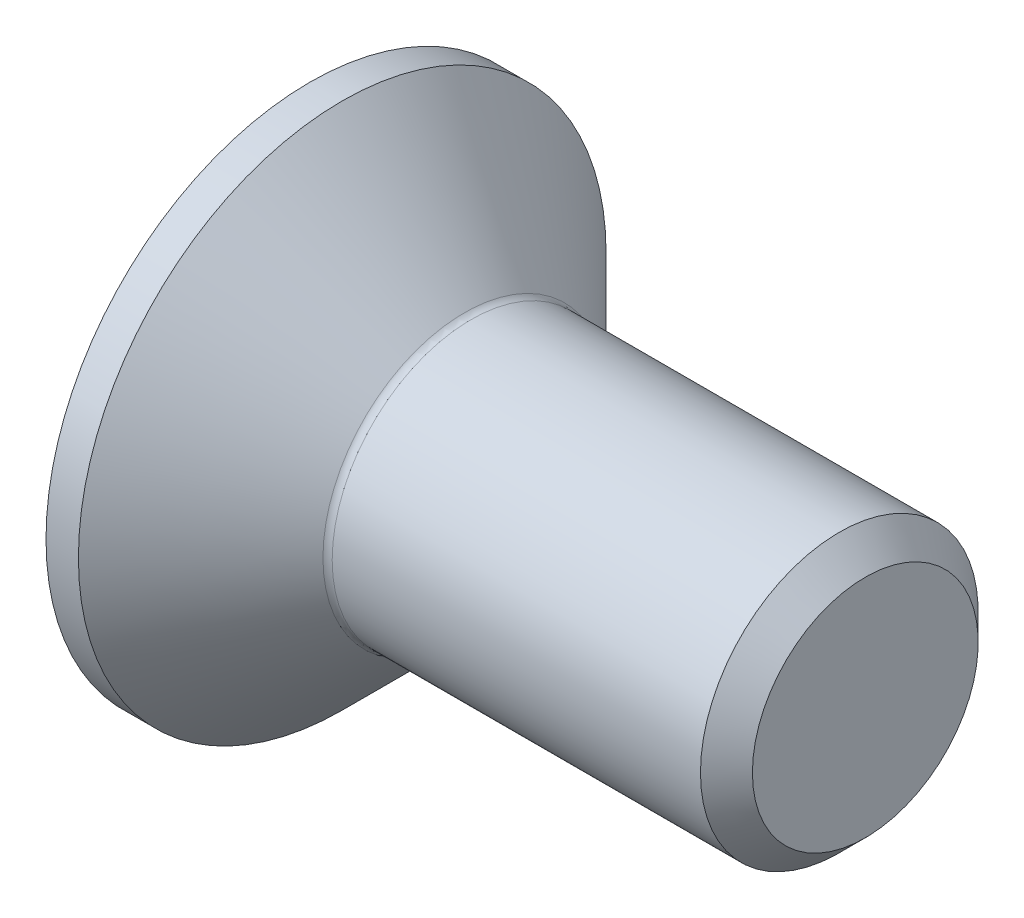
ISO-10303-21;
HEADER;
FILE_DESCRIPTION(('STEP AP214'),'2;1');
FILE_NAME('part.step','',(''),(''),'','','');
FILE_SCHEMA(('AUTOMOTIVE_DESIGN { 1 0 10303 214 1 1 1 1 }'));
ENDSEC;
DATA;
#1=APPLICATION_CONTEXT('core data for automotive mechanical design processes');
#2=APPLICATION_PROTOCOL_DEFINITION('international standard','automotive_design',2000,#1);
#3=PRODUCT_CONTEXT('',#1,'mechanical');
#4=PRODUCT('Part','Part','',(#3));
#5=PRODUCT_RELATED_PRODUCT_CATEGORY('part','',(#4));
#6=PRODUCT_DEFINITION_FORMATION('','',#4);
#7=PRODUCT_DEFINITION_CONTEXT('part definition',#1,'design');
#8=PRODUCT_DEFINITION('design','',#6,#7);
#9=PRODUCT_DEFINITION_SHAPE('','',#8);
#10=(LENGTH_UNIT() NAMED_UNIT(*) SI_UNIT(.MILLI.,.METRE.));
#11=(NAMED_UNIT(*) PLANE_ANGLE_UNIT() SI_UNIT($,.RADIAN.));
#12=(NAMED_UNIT(*) SI_UNIT($,.STERADIAN.) SOLID_ANGLE_UNIT());
#13=UNCERTAINTY_MEASURE_WITH_UNIT(LENGTH_MEASURE(1.E-05),#10,'distance_accuracy_value','');
#14=(GEOMETRIC_REPRESENTATION_CONTEXT(3) GLOBAL_UNCERTAINTY_ASSIGNED_CONTEXT((#13)) GLOBAL_UNIT_ASSIGNED_CONTEXT((#10,
#11,#12)) REPRESENTATION_CONTEXT('',''));
#15=CARTESIAN_POINT('',(0.,0.,0.));
#16=DIRECTION('',(0.,0.,1.));
#17=DIRECTION('',(1.,0.,0.));
#18=AXIS2_PLACEMENT_3D('',#15,#16,#17);
#19=CARTESIAN_POINT('',(6.,1.2195,0.));
#20=DIRECTION('',(1.,0.,0.));
#21=DIRECTION('',(0.,0.,-1.));
#22=AXIS2_PLACEMENT_3D('',#19,#20,#21);
#23=PLANE('',#22);
#24=CARTESIAN_POINT('',(5.99999999997181,0.,0.));
#25=DIRECTION('',(-1.,0.,0.));
#26=DIRECTION('',(0.,0.,1.));
#27=AXIS2_PLACEMENT_3D('',#24,#25,#26);
#28=CIRCLE('',#27,1.21950000004745);
#29=CARTESIAN_POINT('',(5.99999999997181,0.,1.21950000004745));
#30=VERTEX_POINT('',#29);
#31=EDGE_CURVE('E19',#30,#30,#28,.T.);
#32=ORIENTED_EDGE('',*,*,#31,.F.);
#33=EDGE_LOOP('',(#32));
#34=FACE_BOUND('',#33,.T.);
#35=ADVANCED_FACE('F16',(#34),#23,.T.);
#36=CARTESIAN_POINT('',(5.71950000011157,0.,0.));
#37=DIRECTION('',(-1.,0.,0.));
#38=DIRECTION('',(0.,0.,1.));
#39=AXIS2_PLACEMENT_3D('',#36,#37,#38);
#40=CONICAL_SURFACE('',#39,1.49999999985084,0.785398163296123);
#41=ORIENTED_EDGE('',*,*,#31,.T.);
#42=EDGE_LOOP('',(#41));
#43=FACE_BOUND('',#42,.T.);
#44=CARTESIAN_POINT('',(5.71949999999997,0.,0.));
#45=DIRECTION('',(-1.,0.,0.));
#46=DIRECTION('',(0.,0.,1.));
#47=AXIS2_PLACEMENT_3D('',#44,#45,#46);
#48=CIRCLE('',#47,1.49999999999998);
#49=CARTESIAN_POINT('',(5.71949999999997,0.,1.49999999999998));
#50=VERTEX_POINT('',#49);
#51=EDGE_CURVE('E308',#50,#50,#48,.T.);
#52=ORIENTED_EDGE('',*,*,#51,.F.);
#53=EDGE_LOOP('',(#52));
#54=FACE_BOUND('',#53,.T.);
#55=ADVANCED_FACE('F231',(#43,#54),#40,.T.);
#56=CARTESIAN_POINT('',(0.,0.,0.));
#57=DIRECTION('',(-1.,0.,0.));
#58=DIRECTION('',(0.,0.,1.));
#59=AXIS2_PLACEMENT_3D('',#56,#57,#58);
#60=CYLINDRICAL_SURFACE('',#59,1.49999999999998);
#61=ORIENTED_EDGE('',*,*,#51,.T.);
#62=EDGE_LOOP('',(#61));
#63=FACE_BOUND('',#62,.T.);
#64=CARTESIAN_POINT('',(1.74142135623733,0.,0.));
#65=DIRECTION('',(-1.,0.,0.));
#66=DIRECTION('',(0.,0.,1.));
#67=AXIS2_PLACEMENT_3D('',#64,#65,#66);
#68=CIRCLE('',#67,1.49999999999998);
#69=CARTESIAN_POINT('',(1.74142135623733,0.,1.49999999999998));
#70=VERTEX_POINT('',#69);
#71=EDGE_CURVE('E218',#70,#70,#68,.F.);
#72=ORIENTED_EDGE('',*,*,#71,.T.);
#73=EDGE_LOOP('',(#72));
#74=FACE_BOUND('',#73,.T.);
#75=ADVANCED_FACE('F227',(#63,#74),#60,.T.);
#76=CARTESIAN_POINT('',(1.74142135623733,0.,0.));
#77=DIRECTION('',(-1.,0.,0.));
#78=DIRECTION('',(0.,0.,1.));
#79=AXIS2_PLACEMENT_3D('',#76,#77,#78);
#80=TOROIDAL_SURFACE('',#79,1.59999999999998,0.1);
#81=ORIENTED_EDGE('',*,*,#71,.F.);
#82=EDGE_LOOP('',(#81));
#83=FACE_BOUND('',#82,.T.);
#84=CARTESIAN_POINT('',(1.67071067812685,0.,0.));
#85=DIRECTION('',(-1.,0.,0.));
#86=DIRECTION('',(0.,0.,1.));
#87=AXIS2_PLACEMENT_3D('',#84,#85,#86);
#88=CIRCLE('',#87,1.52928932192253);
#89=CARTESIAN_POINT('',(1.67071067812685,0.,1.52928932192253));
#90=VERTEX_POINT('',#89);
#91=EDGE_CURVE('E97',#90,#90,#88,.T.);
#92=ORIENTED_EDGE('',*,*,#91,.F.);
#93=EDGE_LOOP('',(#92));
#94=FACE_BOUND('',#93,.T.);
#95=ADVANCED_FACE('F223',(#83,#94),#80,.F.);
#96=CARTESIAN_POINT('',(1.20000000015352,0.,0.));
#97=DIRECTION('',(-1.,0.,0.));
#98=DIRECTION('',(0.,0.,1.));
#99=AXIS2_PLACEMENT_3D('',#96,#97,#98);
#100=CONICAL_SURFACE('',#99,1.00999999978058,1.04719755090824);
#101=CARTESIAN_POINT('',(1.78312377201451,0.,-3.41060513164848E-10));
#102=VERTEX_POINT('',#101);
#103=VERTEX_LOOP('',#102);
#104=FACE_BOUND('',#103,.T.);
#105=CARTESIAN_POINT('',(1.20000000005507,0.,0.));
#106=DIRECTION('',(-1.,0.,0.));
#107=DIRECTION('',(0.,0.,1.));
#108=AXIS2_PLACEMENT_3D('',#105,#106,#107);
#109=CIRCLE('',#108,1.00999999995111);
#110=CARTESIAN_POINT('',(1.20000000002328,0.,-1.00999999999175));
#111=VERTEX_POINT('',#110);
#112=CARTESIAN_POINT('',(1.20000000002753,0.874685657801112,-0.504999999987776));
#113=VERTEX_POINT('',#112);
#114=EDGE_CURVE('E314',#111,#113,#109,.F.);
#115=ORIENTED_EDGE('',*,*,#114,.F.);
#116=CARTESIAN_POINT('',(1.20000000005507,0.,0.));
#117=DIRECTION('',(-1.,0.,0.));
#118=DIRECTION('',(0.,0.,1.));
#119=AXIS2_PLACEMENT_3D('',#116,#117,#118);
#120=CIRCLE('',#119,1.00999999995111);
#121=CARTESIAN_POINT('',(1.20000000002753,-0.874685657801111,-0.504999999987777));
#122=VERTEX_POINT('',#121);
#123=EDGE_CURVE('E92',#122,#111,#120,.F.);
#124=ORIENTED_EDGE('',*,*,#123,.F.);
#125=CARTESIAN_POINT('',(1.20000000005507,0.,0.));
#126=DIRECTION('',(-1.,0.,0.));
#127=DIRECTION('',(0.,0.,1.));
#128=AXIS2_PLACEMENT_3D('',#125,#126,#127);
#129=CIRCLE('',#128,1.00999999995111);
#130=CARTESIAN_POINT('',(1.20000000002753,-0.874685657801111,0.504999999987777));
#131=VERTEX_POINT('',#130);
#132=EDGE_CURVE('E86',#131,#122,#129,.F.);
#133=ORIENTED_EDGE('',*,*,#132,.F.);
#134=CARTESIAN_POINT('',(1.20000000005507,0.,0.));
#135=DIRECTION('',(-1.,0.,0.));
#136=DIRECTION('',(0.,0.,1.));
#137=AXIS2_PLACEMENT_3D('',#134,#135,#136);
#138=CIRCLE('',#137,1.00999999995111);
#139=CARTESIAN_POINT('',(1.20000000002328,0.,1.00999999999175));
#140=VERTEX_POINT('',#139);
#141=EDGE_CURVE('E89',#140,#131,#138,.F.);
#142=ORIENTED_EDGE('',*,*,#141,.F.);
#143=CARTESIAN_POINT('',(1.20000000005507,0.,0.));
#144=DIRECTION('',(-1.,0.,0.));
#145=DIRECTION('',(0.,0.,1.));
#146=AXIS2_PLACEMENT_3D('',#143,#144,#145);
#147=CIRCLE('',#146,1.00999999995111);
#148=CARTESIAN_POINT('',(1.20000000002753,0.874685657801111,0.504999999987777));
#149=VERTEX_POINT('',#148);
#150=EDGE_CURVE('E108',#149,#140,#147,.F.);
#151=ORIENTED_EDGE('',*,*,#150,.F.);
#152=CARTESIAN_POINT('',(1.20000000005507,0.,0.));
#153=DIRECTION('',(-1.,0.,0.));
#154=DIRECTION('',(0.,0.,1.));
#155=AXIS2_PLACEMENT_3D('',#152,#153,#154);
#156=CIRCLE('',#155,1.00999999995111);
#157=EDGE_CURVE('E311',#113,#149,#156,.F.);
#158=ORIENTED_EDGE('',*,*,#157,.F.);
#159=EDGE_LOOP('',(#115,#124,#133,#142,#151,#158));
#160=FACE_BOUND('',#159,.T.);
#161=ADVANCED_FACE('F88',(#104,#160),#100,.F.);
#162=CARTESIAN_POINT('',(0.350000000082673,0.,0.));
#163=DIRECTION('',(-1.,0.,0.));
#164=DIRECTION('',(0.,0.,1.));
#165=AXIS2_PLACEMENT_3D('',#162,#163,#164);
#166=CONICAL_SURFACE('',#165,2.84999999996671,0.785398163397448);
#167=ORIENTED_EDGE('',*,*,#91,.T.);
#168=EDGE_LOOP('',(#167));
#169=FACE_BOUND('',#168,.T.);
#170=CARTESIAN_POINT('',(0.350000000000005,0.,0.));
#171=DIRECTION('',(-1.,0.,0.));
#172=DIRECTION('',(0.,0.,1.));
#173=AXIS2_PLACEMENT_3D('',#170,#171,#172);
#174=CIRCLE('',#173,2.85);
#175=CARTESIAN_POINT('',(0.350000000000005,0.,2.85));
#176=VERTEX_POINT('',#175);
#177=EDGE_CURVE('E107',#176,#176,#174,.T.);
#178=ORIENTED_EDGE('',*,*,#177,.F.);
#179=EDGE_LOOP('',(#178));
#180=FACE_BOUND('',#179,.T.);
#181=ADVANCED_FACE('F294',(#169,#180),#166,.T.);
#182=CARTESIAN_POINT('',(1.2,-1.16624754376304,0.));
#183=DIRECTION('',(-1.,0.,0.));
#184=DIRECTION('',(0.,0.,1.));
#185=AXIS2_PLACEMENT_3D('',#182,#183,#184);
#186=PLANE('',#185);
#187=DIRECTION('',(0.,-0.5,0.866025403784438));
#188=VECTOR('',#187,1.);
#189=CARTESIAN_POINT('',(1.2,-1.16624754376304,0.));
#190=LINE('',#189,#188);
#191=CARTESIAN_POINT('',(1.2,-1.16624754376304,0.));
#192=VERTEX_POINT('',#191);
#193=EDGE_CURVE('E113',#192,#122,#190,.F.);
#194=ORIENTED_EDGE('',*,*,#193,.F.);
#195=DIRECTION('',(0.,0.5,0.866025403784438));
#196=VECTOR('',#195,1.);
#197=CARTESIAN_POINT('',(1.2,-0.583123771881522,1.01));
#198=LINE('',#197,#196);
#199=EDGE_CURVE('E110',#131,#192,#198,.F.);
#200=ORIENTED_EDGE('',*,*,#199,.F.);
#201=ORIENTED_EDGE('',*,*,#132,.T.);
#202=EDGE_LOOP('',(#194,#200,#201));
#203=FACE_BOUND('',#202,.T.);
#204=ADVANCED_FACE('F111',(#203),#186,.T.);
#205=CARTESIAN_POINT('',(1.2,-1.16624754376304,0.));
#206=DIRECTION('',(-1.,0.,0.));
#207=DIRECTION('',(0.,0.,1.));
#208=AXIS2_PLACEMENT_3D('',#205,#206,#207);
#209=PLANE('',#208);
#210=DIRECTION('',(0.,-1.,0.));
#211=VECTOR('',#210,1.);
#212=CARTESIAN_POINT('',(1.2,-0.583123771881522,-1.01));
#213=LINE('',#212,#211);
#214=CARTESIAN_POINT('',(1.2,-0.583123771881521,-1.01));
#215=VERTEX_POINT('',#214);
#216=EDGE_CURVE('E177',#215,#111,#213,.F.);
#217=ORIENTED_EDGE('',*,*,#216,.F.);
#218=DIRECTION('',(0.,-0.5,0.866025403784438));
#219=VECTOR('',#218,1.);
#220=CARTESIAN_POINT('',(1.2,-1.16624754376304,0.));
#221=LINE('',#220,#219);
#222=EDGE_CURVE('E192',#122,#215,#221,.F.);
#223=ORIENTED_EDGE('',*,*,#222,.F.);
#224=ORIENTED_EDGE('',*,*,#123,.T.);
#225=EDGE_LOOP('',(#217,#223,#224));
#226=FACE_BOUND('',#225,.T.);
#227=ADVANCED_FACE('F288',(#226),#209,.T.);
#228=CARTESIAN_POINT('',(1.2,-1.16624754376304,0.));
#229=DIRECTION('',(-1.,0.,0.));
#230=DIRECTION('',(0.,0.,1.));
#231=AXIS2_PLACEMENT_3D('',#228,#229,#230);
#232=PLANE('',#231);
#233=DIRECTION('',(0.,-0.5,-0.866025403784439));
#234=VECTOR('',#233,1.);
#235=CARTESIAN_POINT('',(1.2,0.583123771881523,-1.01));
#236=LINE('',#235,#234);
#237=CARTESIAN_POINT('',(1.2,0.583123771881523,-1.01));
#238=VERTEX_POINT('',#237);
#239=EDGE_CURVE('E158',#238,#113,#236,.F.);
#240=ORIENTED_EDGE('',*,*,#239,.F.);
#241=DIRECTION('',(0.,-1.,0.));
#242=VECTOR('',#241,1.);
#243=CARTESIAN_POINT('',(1.2,-0.583123771881522,-1.01));
#244=LINE('',#243,#242);
#245=EDGE_CURVE('E173',#111,#238,#244,.F.);
#246=ORIENTED_EDGE('',*,*,#245,.F.);
#247=ORIENTED_EDGE('',*,*,#114,.T.);
#248=EDGE_LOOP('',(#240,#246,#247));
#249=FACE_BOUND('',#248,.T.);
#250=ADVANCED_FACE('F284',(#249),#232,.T.);
#251=CARTESIAN_POINT('',(1.2,-1.16624754376304,0.));
#252=DIRECTION('',(-1.,0.,0.));
#253=DIRECTION('',(0.,0.,1.));
#254=AXIS2_PLACEMENT_3D('',#251,#252,#253);
#255=PLANE('',#254);
#256=DIRECTION('',(0.,0.5,-0.866025403784439));
#257=VECTOR('',#256,1.);
#258=CARTESIAN_POINT('',(1.2,1.16624754376305,0.));
#259=LINE('',#258,#257);
#260=CARTESIAN_POINT('',(1.2,1.16624754376305,0.));
#261=VERTEX_POINT('',#260);
#262=EDGE_CURVE('E137',#261,#149,#259,.F.);
#263=ORIENTED_EDGE('',*,*,#262,.F.);
#264=DIRECTION('',(0.,-0.5,-0.866025403784439));
#265=VECTOR('',#264,1.);
#266=CARTESIAN_POINT('',(1.2,0.583123771881523,-1.01));
#267=LINE('',#266,#265);
#268=EDGE_CURVE('E154',#113,#261,#267,.F.);
#269=ORIENTED_EDGE('',*,*,#268,.F.);
#270=ORIENTED_EDGE('',*,*,#157,.T.);
#271=EDGE_LOOP('',(#263,#269,#270));
#272=FACE_BOUND('',#271,.T.);
#273=ADVANCED_FACE('F280',(#272),#255,.T.);
#274=CARTESIAN_POINT('',(1.2,-1.16624754376304,0.));
#275=DIRECTION('',(-1.,0.,0.));
#276=DIRECTION('',(0.,0.,1.));
#277=AXIS2_PLACEMENT_3D('',#274,#275,#276);
#278=PLANE('',#277);
#279=DIRECTION('',(0.,1.,0.));
#280=VECTOR('',#279,1.);
#281=CARTESIAN_POINT('',(1.2,0.583123771881523,1.01));
#282=LINE('',#281,#280);
#283=CARTESIAN_POINT('',(1.2,0.583123771881523,1.01));
#284=VERTEX_POINT('',#283);
#285=EDGE_CURVE('E132',#284,#140,#282,.F.);
#286=ORIENTED_EDGE('',*,*,#285,.F.);
#287=DIRECTION('',(0.,0.5,-0.866025403784439));
#288=VECTOR('',#287,1.);
#289=CARTESIAN_POINT('',(1.2,1.16624754376305,0.));
#290=LINE('',#289,#288);
#291=EDGE_CURVE('E133',#149,#284,#290,.F.);
#292=ORIENTED_EDGE('',*,*,#291,.F.);
#293=ORIENTED_EDGE('',*,*,#150,.T.);
#294=EDGE_LOOP('',(#286,#292,#293));
#295=FACE_BOUND('',#294,.T.);
#296=ADVANCED_FACE('F277',(#295),#278,.T.);
#297=CARTESIAN_POINT('',(1.2,-1.16624754376304,0.));
#298=DIRECTION('',(-1.,0.,0.));
#299=DIRECTION('',(0.,0.,1.));
#300=AXIS2_PLACEMENT_3D('',#297,#298,#299);
#301=PLANE('',#300);
#302=DIRECTION('',(0.,0.5,0.866025403784438));
#303=VECTOR('',#302,1.);
#304=CARTESIAN_POINT('',(1.2,-0.583123771881522,1.01));
#305=LINE('',#304,#303);
#306=CARTESIAN_POINT('',(1.2,-0.583123771881521,1.01));
#307=VERTEX_POINT('',#306);
#308=EDGE_CURVE('E102',#307,#131,#305,.F.);
#309=ORIENTED_EDGE('',*,*,#308,.F.);
#310=DIRECTION('',(0.,1.,0.));
#311=VECTOR('',#310,1.);
#312=CARTESIAN_POINT('',(1.2,0.583123771881523,1.01));
#313=LINE('',#312,#311);
#314=EDGE_CURVE('E105',#140,#307,#313,.F.);
#315=ORIENTED_EDGE('',*,*,#314,.F.);
#316=ORIENTED_EDGE('',*,*,#141,.T.);
#317=EDGE_LOOP('',(#309,#315,#316));
#318=FACE_BOUND('',#317,.T.);
#319=ADVANCED_FACE('F100',(#318),#301,.T.);
#320=CARTESIAN_POINT('',(0.,0.,0.));
#321=DIRECTION('',(-1.,0.,0.));
#322=DIRECTION('',(0.,0.,1.));
#323=AXIS2_PLACEMENT_3D('',#320,#321,#322);
#324=CYLINDRICAL_SURFACE('',#323,2.85);
#325=ORIENTED_EDGE('',*,*,#177,.T.);
#326=EDGE_LOOP('',(#325));
#327=FACE_BOUND('',#326,.T.);
#328=CARTESIAN_POINT('',(0.,0.,0.));
#329=DIRECTION('',(-1.,0.,0.));
#330=DIRECTION('',(0.,0.,1.));
#331=AXIS2_PLACEMENT_3D('',#328,#329,#330);
#332=CIRCLE('',#331,2.85);
#333=CARTESIAN_POINT('',(0.,0.,2.85));
#334=VERTEX_POINT('',#333);
#335=EDGE_CURVE('E213',#334,#334,#332,.T.);
#336=ORIENTED_EDGE('',*,*,#335,.F.);
#337=EDGE_LOOP('',(#336));
#338=FACE_BOUND('',#337,.T.);
#339=ADVANCED_FACE('F271',(#327,#338),#324,.T.);
#340=CARTESIAN_POINT('',(1.2,-0.583123771881522,1.01));
#341=DIRECTION('',(0.,0.866025403784438,-0.5));
#342=DIRECTION('',(0.,0.5,0.866025403784438));
#343=AXIS2_PLACEMENT_3D('',#340,#341,#342);
#344=PLANE('',#343);
#345=ORIENTED_EDGE('',*,*,#199,.T.);
#346=DIRECTION('',(1.,0.,0.));
#347=VECTOR('',#346,1.);
#348=CARTESIAN_POINT('',(1.2,-1.16624754376304,0.));
#349=LINE('',#348,#347);
#350=CARTESIAN_POINT('',(0.,-1.16624754376304,0.));
#351=VERTEX_POINT('',#350);
#352=EDGE_CURVE('E116',#351,#192,#349,.T.);
#353=ORIENTED_EDGE('',*,*,#352,.F.);
#354=DIRECTION('',(0.,-0.5,-0.866025403784438));
#355=VECTOR('',#354,1.);
#356=CARTESIAN_POINT('',(0.,-0.583123771881522,1.01));
#357=LINE('',#356,#355);
#358=CARTESIAN_POINT('',(0.,-0.583123771881521,1.01));
#359=VERTEX_POINT('',#358);
#360=EDGE_CURVE('E200',#359,#351,#357,.T.);
#361=ORIENTED_EDGE('',*,*,#360,.F.);
#362=DIRECTION('',(-1.,0.,0.));
#363=VECTOR('',#362,1.);
#364=CARTESIAN_POINT('',(1.2,-0.583123771881521,1.01));
#365=LINE('',#364,#363);
#366=EDGE_CURVE('E121',#307,#359,#365,.T.);
#367=ORIENTED_EDGE('',*,*,#366,.F.);
#368=ORIENTED_EDGE('',*,*,#308,.T.);
#369=EDGE_LOOP('',(#345,#353,#361,#367,#368));
#370=FACE_BOUND('',#369,.T.);
#371=ADVANCED_FACE('F118',(#370),#344,.T.);
#372=CARTESIAN_POINT('',(1.2,-1.16624754376304,0.));
#373=DIRECTION('',(0.,0.866025403784438,0.5));
#374=DIRECTION('',(0.,-0.5,0.866025403784438));
#375=AXIS2_PLACEMENT_3D('',#372,#373,#374);
#376=PLANE('',#375);
#377=ORIENTED_EDGE('',*,*,#222,.T.);
#378=DIRECTION('',(1.,0.,0.));
#379=VECTOR('',#378,1.);
#380=CARTESIAN_POINT('',(1.2,-0.583123771881522,-1.01));
#381=LINE('',#380,#379);
#382=CARTESIAN_POINT('',(0.,-0.583123771881521,-1.01));
#383=VERTEX_POINT('',#382);
#384=EDGE_CURVE('E187',#383,#215,#381,.T.);
#385=ORIENTED_EDGE('',*,*,#384,.F.);
#386=DIRECTION('',(0.,0.5,-0.866025403784438));
#387=VECTOR('',#386,1.);
#388=CARTESIAN_POINT('',(0.,-1.16624754376304,0.));
#389=LINE('',#388,#387);
#390=EDGE_CURVE('E182',#351,#383,#389,.T.);
#391=ORIENTED_EDGE('',*,*,#390,.F.);
#392=ORIENTED_EDGE('',*,*,#352,.T.);
#393=ORIENTED_EDGE('',*,*,#193,.T.);
#394=EDGE_LOOP('',(#377,#385,#391,#392,#393));
#395=FACE_BOUND('',#394,.T.);
#396=ADVANCED_FACE('F264',(#395),#376,.T.);
#397=CARTESIAN_POINT('',(1.2,-0.583123771881522,-1.01));
#398=DIRECTION('',(0.,0.,1.));
#399=DIRECTION('',(0.,-1.,0.));
#400=AXIS2_PLACEMENT_3D('',#397,#398,#399);
#401=PLANE('',#400);
#402=ORIENTED_EDGE('',*,*,#245,.T.);
#403=DIRECTION('',(1.,0.,0.));
#404=VECTOR('',#403,1.);
#405=CARTESIAN_POINT('',(1.2,0.583123771881523,-1.01));
#406=LINE('',#405,#404);
#407=CARTESIAN_POINT('',(0.,0.583123771881523,-1.01));
#408=VERTEX_POINT('',#407);
#409=EDGE_CURVE('E168',#408,#238,#406,.T.);
#410=ORIENTED_EDGE('',*,*,#409,.F.);
#411=DIRECTION('',(0.,1.,0.));
#412=VECTOR('',#411,1.);
#413=CARTESIAN_POINT('',(0.,0.,-1.01));
#414=LINE('',#413,#412);
#415=EDGE_CURVE('E163',#383,#408,#414,.T.);
#416=ORIENTED_EDGE('',*,*,#415,.F.);
#417=ORIENTED_EDGE('',*,*,#384,.T.);
#418=ORIENTED_EDGE('',*,*,#216,.T.);
#419=EDGE_LOOP('',(#402,#410,#416,#417,#418));
#420=FACE_BOUND('',#419,.T.);
#421=ADVANCED_FACE('F260',(#420),#401,.T.);
#422=CARTESIAN_POINT('',(1.2,0.583123771881523,-1.01));
#423=DIRECTION('',(0.,-0.866025403784439,0.5));
#424=DIRECTION('',(0.,-0.5,-0.866025403784439));
#425=AXIS2_PLACEMENT_3D('',#422,#423,#424);
#426=PLANE('',#425);
#427=ORIENTED_EDGE('',*,*,#268,.T.);
#428=DIRECTION('',(1.,0.,0.));
#429=VECTOR('',#428,1.);
#430=CARTESIAN_POINT('',(1.2,1.16624754376305,0.));
#431=LINE('',#430,#429);
#432=CARTESIAN_POINT('',(0.,1.16624754376305,0.));
#433=VERTEX_POINT('',#432);
#434=EDGE_CURVE('E149',#433,#261,#431,.T.);
#435=ORIENTED_EDGE('',*,*,#434,.F.);
#436=DIRECTION('',(0.,0.5,0.866025403784439));
#437=VECTOR('',#436,1.);
#438=CARTESIAN_POINT('',(0.,0.583123771881523,-1.01));
#439=LINE('',#438,#437);
#440=EDGE_CURVE('E144',#408,#433,#439,.T.);
#441=ORIENTED_EDGE('',*,*,#440,.F.);
#442=ORIENTED_EDGE('',*,*,#409,.T.);
#443=ORIENTED_EDGE('',*,*,#239,.T.);
#444=EDGE_LOOP('',(#427,#435,#441,#442,#443));
#445=FACE_BOUND('',#444,.T.);
#446=ADVANCED_FACE('F257',(#445),#426,.T.);
#447=CARTESIAN_POINT('',(1.2,1.16624754376305,0.));
#448=DIRECTION('',(0.,-0.866025403784439,-0.5));
#449=DIRECTION('',(0.,0.5,-0.866025403784439));
#450=AXIS2_PLACEMENT_3D('',#447,#448,#449);
#451=PLANE('',#450);
#452=ORIENTED_EDGE('',*,*,#291,.T.);
#453=DIRECTION('',(-1.,0.,0.));
#454=VECTOR('',#453,1.);
#455=CARTESIAN_POINT('',(1.2,0.583123771881523,1.01));
#456=LINE('',#455,#454);
#457=CARTESIAN_POINT('',(0.,0.583123771881523,1.01));
#458=VERTEX_POINT('',#457);
#459=EDGE_CURVE('E34',#458,#284,#456,.F.);
#460=ORIENTED_EDGE('',*,*,#459,.F.);
#461=DIRECTION('',(0.,-0.5,0.866025403784439));
#462=VECTOR('',#461,1.);
#463=CARTESIAN_POINT('',(0.,1.16624754376305,0.));
#464=LINE('',#463,#462);
#465=EDGE_CURVE('E25',#433,#458,#464,.T.);
#466=ORIENTED_EDGE('',*,*,#465,.F.);
#467=ORIENTED_EDGE('',*,*,#434,.T.);
#468=ORIENTED_EDGE('',*,*,#262,.T.);
#469=EDGE_LOOP('',(#452,#460,#466,#467,#468));
#470=FACE_BOUND('',#469,.T.);
#471=ADVANCED_FACE('F250',(#470),#451,.T.);
#472=CARTESIAN_POINT('',(1.2,0.583123771881523,1.01));
#473=DIRECTION('',(0.,0.,-1.));
#474=DIRECTION('',(-1.,0.,0.));
#475=AXIS2_PLACEMENT_3D('',#472,#473,#474);
#476=PLANE('',#475);
#477=ORIENTED_EDGE('',*,*,#314,.T.);
#478=ORIENTED_EDGE('',*,*,#366,.T.);
#479=DIRECTION('',(0.,1.,0.));
#480=VECTOR('',#479,1.);
#481=CARTESIAN_POINT('',(0.,0.,1.01));
#482=LINE('',#481,#480);
#483=EDGE_CURVE('E11',#458,#359,#482,.F.);
#484=ORIENTED_EDGE('',*,*,#483,.F.);
#485=ORIENTED_EDGE('',*,*,#459,.T.);
#486=ORIENTED_EDGE('',*,*,#285,.T.);
#487=EDGE_LOOP('',(#477,#478,#484,#485,#486));
#488=FACE_BOUND('',#487,.T.);
#489=ADVANCED_FACE('F244',(#488),#476,.T.);
#490=CARTESIAN_POINT('',(0.,0.,0.));
#491=DIRECTION('',(-1.,0.,0.));
#492=DIRECTION('',(0.,0.,1.));
#493=AXIS2_PLACEMENT_3D('',#490,#491,#492);
#494=PLANE('',#493);
#495=ORIENTED_EDGE('',*,*,#465,.T.);
#496=ORIENTED_EDGE('',*,*,#483,.T.);
#497=ORIENTED_EDGE('',*,*,#360,.T.);
#498=ORIENTED_EDGE('',*,*,#390,.T.);
#499=ORIENTED_EDGE('',*,*,#415,.T.);
#500=ORIENTED_EDGE('',*,*,#440,.T.);
#501=EDGE_LOOP('',(#495,#496,#497,#498,#499,#500));
#502=FACE_BOUND('',#501,.T.);
#503=ORIENTED_EDGE('',*,*,#335,.T.);
#504=EDGE_LOOP('',(#503));
#505=FACE_BOUND('',#504,.T.);
#506=ADVANCED_FACE('F242',(#502,#505),#494,.T.);
#507=CLOSED_SHELL('',(#35,#55,#75,#95,#161,#181,#204,#227,#250,#273,#296,#319,#339,#371,#396,
#421,#446,#471,#489,#506));
#508=MANIFOLD_SOLID_BREP('B1',#507);
#509=ADVANCED_BREP_SHAPE_REPRESENTATION('',(#18,#508),#14);
#510=SHAPE_DEFINITION_REPRESENTATION(#9,#509);
ENDSEC;
END-ISO-10303-21;
